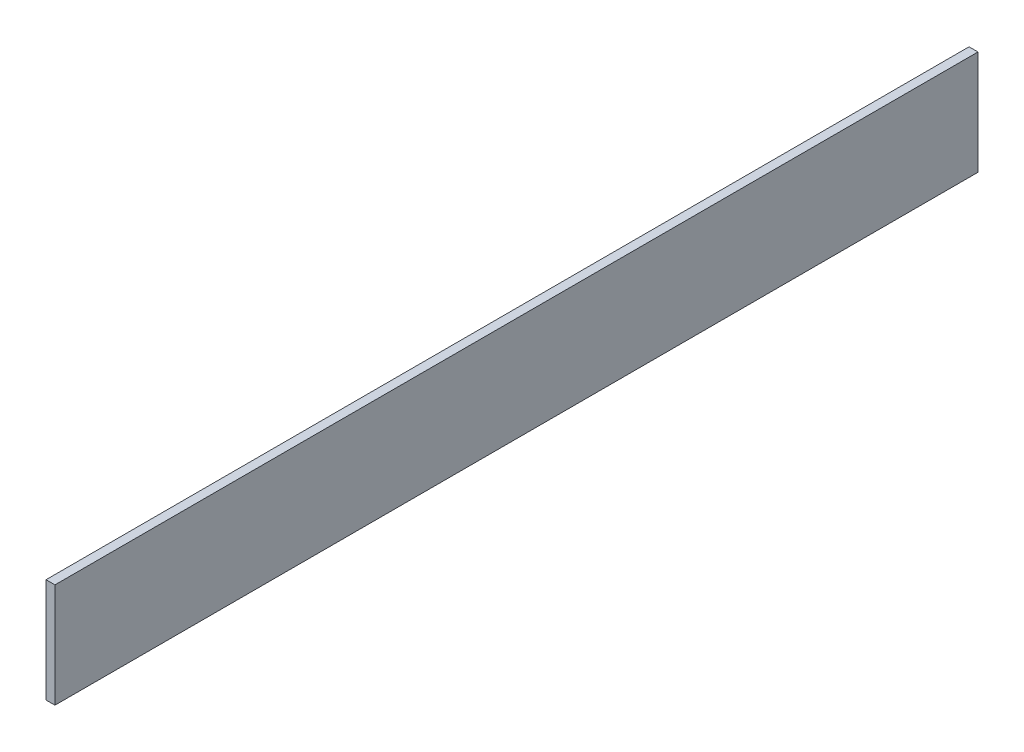
ISO-10303-21;
HEADER;
FILE_DESCRIPTION(('STEP AP214'),'2;1');
FILE_NAME('part.step','',(''),(''),'','','');
FILE_SCHEMA(('AUTOMOTIVE_DESIGN { 1 0 10303 214 1 1 1 1 }'));
ENDSEC;
DATA;
#1=APPLICATION_CONTEXT('core data for automotive mechanical design processes');
#2=APPLICATION_PROTOCOL_DEFINITION('international standard','automotive_design',2000,#1);
#3=PRODUCT_CONTEXT('',#1,'mechanical');
#4=PRODUCT('Part','Part','',(#3));
#5=PRODUCT_RELATED_PRODUCT_CATEGORY('part','',(#4));
#6=PRODUCT_DEFINITION_FORMATION('','',#4);
#7=PRODUCT_DEFINITION_CONTEXT('part definition',#1,'design');
#8=PRODUCT_DEFINITION('design','',#6,#7);
#9=PRODUCT_DEFINITION_SHAPE('','',#8);
#10=(LENGTH_UNIT() NAMED_UNIT(*) SI_UNIT(.MILLI.,.METRE.));
#11=(NAMED_UNIT(*) PLANE_ANGLE_UNIT() SI_UNIT($,.RADIAN.));
#12=(NAMED_UNIT(*) SI_UNIT($,.STERADIAN.) SOLID_ANGLE_UNIT());
#13=UNCERTAINTY_MEASURE_WITH_UNIT(LENGTH_MEASURE(1.E-05),#10,'distance_accuracy_value','');
#14=(GEOMETRIC_REPRESENTATION_CONTEXT(3) GLOBAL_UNCERTAINTY_ASSIGNED_CONTEXT((#13)) GLOBAL_UNIT_ASSIGNED_CONTEXT((#10,
#11,#12)) REPRESENTATION_CONTEXT('',''));
#15=CARTESIAN_POINT('',(0.,0.,0.));
#16=DIRECTION('',(0.,0.,1.));
#17=DIRECTION('',(1.,0.,0.));
#18=AXIS2_PLACEMENT_3D('',#15,#16,#17);
#19=CARTESIAN_POINT('',(3.,0.,0.));
#20=DIRECTION('',(0.,0.,-1.));
#21=DIRECTION('',(-1.,0.,0.));
#22=AXIS2_PLACEMENT_3D('',#19,#20,#21);
#23=PLANE('',#22);
#24=DIRECTION('',(0.,-1.,0.));
#25=VECTOR('',#24,1.);
#26=CARTESIAN_POINT('',(0.,0.,0.));
#27=LINE('',#26,#25);
#28=CARTESIAN_POINT('',(0.,35.,0.));
#29=VERTEX_POINT('',#28);
#30=CARTESIAN_POINT('',(0.,0.,0.));
#31=VERTEX_POINT('',#30);
#32=EDGE_CURVE('E98',#29,#31,#27,.T.);
#33=ORIENTED_EDGE('',*,*,#32,.T.);
#34=DIRECTION('',(-1.,0.,0.));
#35=VECTOR('',#34,1.);
#36=CARTESIAN_POINT('',(3.,0.,0.));
#37=LINE('',#36,#35);
#38=CARTESIAN_POINT('',(3.,0.,0.));
#39=VERTEX_POINT('',#38);
#40=EDGE_CURVE('E11',#39,#31,#37,.T.);
#41=ORIENTED_EDGE('',*,*,#40,.F.);
#42=DIRECTION('',(0.,-1.,0.));
#43=VECTOR('',#42,1.);
#44=CARTESIAN_POINT('',(3.,0.,0.));
#45=LINE('',#44,#43);
#46=CARTESIAN_POINT('',(3.,35.,0.));
#47=VERTEX_POINT('',#46);
#48=EDGE_CURVE('E86',#47,#39,#45,.T.);
#49=ORIENTED_EDGE('',*,*,#48,.F.);
#50=DIRECTION('',(-1.,0.,0.));
#51=VECTOR('',#50,1.);
#52=CARTESIAN_POINT('',(3.,35.,0.));
#53=LINE('',#52,#51);
#54=EDGE_CURVE('E94',#47,#29,#53,.T.);
#55=ORIENTED_EDGE('',*,*,#54,.T.);
#56=EDGE_LOOP('',(#33,#41,#49,#55));
#57=FACE_BOUND('',#56,.T.);
#58=ADVANCED_FACE('F35',(#57),#23,.F.);
#59=CARTESIAN_POINT('',(3.,0.,0.));
#60=DIRECTION('',(0.,1.,0.));
#61=DIRECTION('',(0.,0.,1.));
#62=AXIS2_PLACEMENT_3D('',#59,#60,#61);
#63=PLANE('',#62);
#64=DIRECTION('',(0.,0.,-1.));
#65=VECTOR('',#64,1.);
#66=CARTESIAN_POINT('',(0.,0.,0.));
#67=LINE('',#66,#65);
#68=CARTESIAN_POINT('',(0.,0.,-310.));
#69=VERTEX_POINT('',#68);
#70=EDGE_CURVE('E90',#31,#69,#67,.T.);
#71=ORIENTED_EDGE('',*,*,#70,.T.);
#72=DIRECTION('',(-1.,0.,0.));
#73=VECTOR('',#72,1.);
#74=CARTESIAN_POINT('',(3.,0.,-310.));
#75=LINE('',#74,#73);
#76=CARTESIAN_POINT('',(3.,0.,-310.));
#77=VERTEX_POINT('',#76);
#78=EDGE_CURVE('E43',#77,#69,#75,.T.);
#79=ORIENTED_EDGE('',*,*,#78,.F.);
#80=DIRECTION('',(0.,0.,-1.));
#81=VECTOR('',#80,1.);
#82=CARTESIAN_POINT('',(3.,0.,0.));
#83=LINE('',#82,#81);
#84=EDGE_CURVE('E81',#39,#77,#83,.T.);
#85=ORIENTED_EDGE('',*,*,#84,.F.);
#86=ORIENTED_EDGE('',*,*,#40,.T.);
#87=EDGE_LOOP('',(#71,#79,#85,#86));
#88=FACE_BOUND('',#87,.T.);
#89=ADVANCED_FACE('F89',(#88),#63,.F.);
#90=CARTESIAN_POINT('',(3.,0.,-310.));
#91=DIRECTION('',(0.,0.,1.));
#92=DIRECTION('',(1.,0.,0.));
#93=AXIS2_PLACEMENT_3D('',#90,#91,#92);
#94=PLANE('',#93);
#95=DIRECTION('',(0.,1.,0.));
#96=VECTOR('',#95,1.);
#97=CARTESIAN_POINT('',(0.,0.,-310.));
#98=LINE('',#97,#96);
#99=CARTESIAN_POINT('',(0.,35.,-310.));
#100=VERTEX_POINT('',#99);
#101=EDGE_CURVE('E68',#69,#100,#98,.T.);
#102=ORIENTED_EDGE('',*,*,#101,.T.);
#103=DIRECTION('',(-1.,0.,0.));
#104=VECTOR('',#103,1.);
#105=CARTESIAN_POINT('',(3.,35.,-310.));
#106=LINE('',#105,#104);
#107=CARTESIAN_POINT('',(3.,35.,-310.));
#108=VERTEX_POINT('',#107);
#109=EDGE_CURVE('E91',#108,#100,#106,.T.);
#110=ORIENTED_EDGE('',*,*,#109,.F.);
#111=DIRECTION('',(0.,1.,0.));
#112=VECTOR('',#111,1.);
#113=CARTESIAN_POINT('',(3.,0.,-310.));
#114=LINE('',#113,#112);
#115=EDGE_CURVE('E84',#77,#108,#114,.T.);
#116=ORIENTED_EDGE('',*,*,#115,.F.);
#117=ORIENTED_EDGE('',*,*,#78,.T.);
#118=EDGE_LOOP('',(#102,#110,#116,#117));
#119=FACE_BOUND('',#118,.T.);
#120=ADVANCED_FACE('F92',(#119),#94,.F.);
#121=CARTESIAN_POINT('',(3.,35.,0.));
#122=DIRECTION('',(0.,-1.,0.));
#123=DIRECTION('',(0.,0.,-1.));
#124=AXIS2_PLACEMENT_3D('',#121,#122,#123);
#125=PLANE('',#124);
#126=DIRECTION('',(0.,0.,1.));
#127=VECTOR('',#126,1.);
#128=CARTESIAN_POINT('',(0.,35.,0.));
#129=LINE('',#128,#127);
#130=EDGE_CURVE('E74',#100,#29,#129,.T.);
#131=ORIENTED_EDGE('',*,*,#130,.T.);
#132=ORIENTED_EDGE('',*,*,#54,.F.);
#133=DIRECTION('',(0.,0.,1.));
#134=VECTOR('',#133,1.);
#135=CARTESIAN_POINT('',(3.,35.,0.));
#136=LINE('',#135,#134);
#137=EDGE_CURVE('E51',#108,#47,#136,.T.);
#138=ORIENTED_EDGE('',*,*,#137,.F.);
#139=ORIENTED_EDGE('',*,*,#109,.T.);
#140=EDGE_LOOP('',(#131,#132,#138,#139));
#141=FACE_BOUND('',#140,.T.);
#142=ADVANCED_FACE('F105',(#141),#125,.F.);
#143=CARTESIAN_POINT('',(3.,0.,0.));
#144=DIRECTION('',(-1.,0.,0.));
#145=DIRECTION('',(0.,0.,1.));
#146=AXIS2_PLACEMENT_3D('',#143,#144,#145);
#147=PLANE('',#146);
#148=ORIENTED_EDGE('',*,*,#48,.T.);
#149=ORIENTED_EDGE('',*,*,#84,.T.);
#150=ORIENTED_EDGE('',*,*,#115,.T.);
#151=ORIENTED_EDGE('',*,*,#137,.T.);
#152=EDGE_LOOP('',(#148,#149,#150,#151));
#153=FACE_BOUND('',#152,.T.);
#154=ADVANCED_FACE('F82',(#153),#147,.F.);
#155=CARTESIAN_POINT('',(0.,0.,0.));
#156=DIRECTION('',(-1.,0.,0.));
#157=DIRECTION('',(0.,0.,1.));
#158=AXIS2_PLACEMENT_3D('',#155,#156,#157);
#159=PLANE('',#158);
#160=ORIENTED_EDGE('',*,*,#32,.F.);
#161=ORIENTED_EDGE('',*,*,#130,.F.);
#162=ORIENTED_EDGE('',*,*,#101,.F.);
#163=ORIENTED_EDGE('',*,*,#70,.F.);
#164=EDGE_LOOP('',(#160,#161,#162,#163));
#165=FACE_BOUND('',#164,.T.);
#166=ADVANCED_FACE('F108',(#165),#159,.T.);
#167=CLOSED_SHELL('',(#58,#89,#120,#142,#154,#166));
#168=MANIFOLD_SOLID_BREP('B2',#167);
#169=ADVANCED_BREP_SHAPE_REPRESENTATION('',(#18,#168),#14);
#170=SHAPE_DEFINITION_REPRESENTATION(#9,#169);
ENDSEC;
END-ISO-10303-21;
